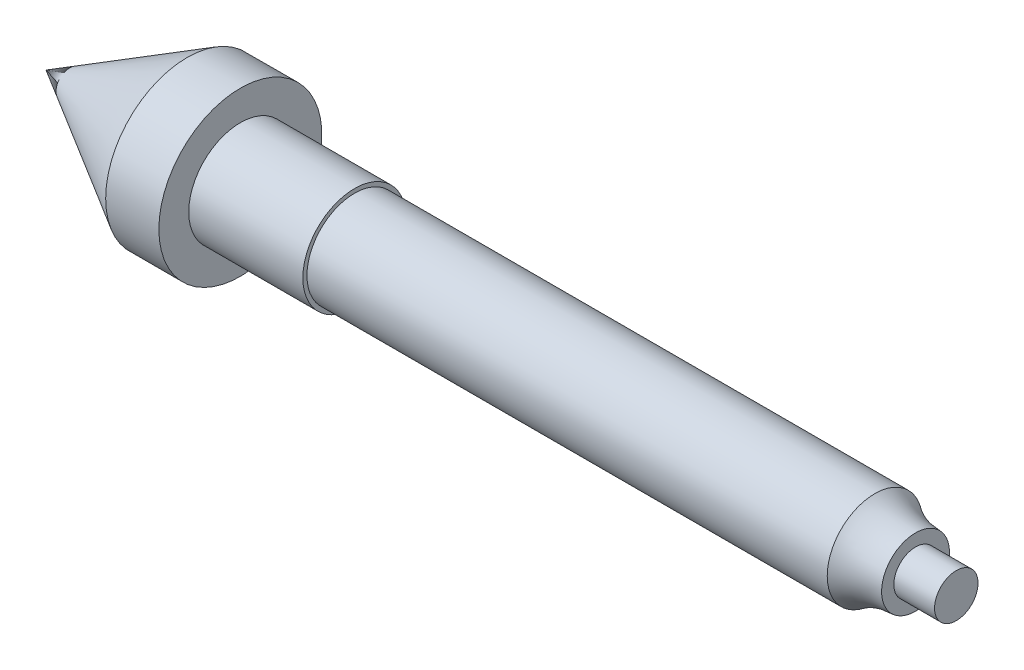
ISO-10303-21;
HEADER;
FILE_DESCRIPTION(('STEP AP214'),'2;1');
FILE_NAME('part.step','',(''),(''),'','','');
FILE_SCHEMA(('AUTOMOTIVE_DESIGN { 1 0 10303 214 1 1 1 1 }'));
ENDSEC;
DATA;
#1=APPLICATION_CONTEXT('core data for automotive mechanical design processes');
#2=APPLICATION_PROTOCOL_DEFINITION('international standard','automotive_design',2000,#1);
#3=PRODUCT_CONTEXT('',#1,'mechanical');
#4=PRODUCT('Part','Part','',(#3));
#5=PRODUCT_RELATED_PRODUCT_CATEGORY('part','',(#4));
#6=PRODUCT_DEFINITION_FORMATION('','',#4);
#7=PRODUCT_DEFINITION_CONTEXT('part definition',#1,'design');
#8=PRODUCT_DEFINITION('design','',#6,#7);
#9=PRODUCT_DEFINITION_SHAPE('','',#8);
#10=(LENGTH_UNIT() NAMED_UNIT(*) SI_UNIT(.MILLI.,.METRE.));
#11=(NAMED_UNIT(*) PLANE_ANGLE_UNIT() SI_UNIT($,.RADIAN.));
#12=(NAMED_UNIT(*) SI_UNIT($,.STERADIAN.) SOLID_ANGLE_UNIT());
#13=UNCERTAINTY_MEASURE_WITH_UNIT(LENGTH_MEASURE(1.E-05),#10,'distance_accuracy_value','');
#14=(GEOMETRIC_REPRESENTATION_CONTEXT(3) GLOBAL_UNCERTAINTY_ASSIGNED_CONTEXT((#13)) GLOBAL_UNIT_ASSIGNED_CONTEXT((#10,
#11,#12)) REPRESENTATION_CONTEXT('',''));
#15=CARTESIAN_POINT('',(0.,0.,0.));
#16=DIRECTION('',(0.,0.,1.));
#17=DIRECTION('',(1.,0.,0.));
#18=AXIS2_PLACEMENT_3D('',#15,#16,#17);
#19=CARTESIAN_POINT('',(-66.5926433104297,0.,0.));
#20=DIRECTION('',(1.,0.,0.));
#21=DIRECTION('',(0.,0.,-1.));
#22=AXIS2_PLACEMENT_3D('',#19,#20,#21);
#23=CONICAL_SURFACE('',#22,0.,0.523598775598301);
#24=CARTESIAN_POINT('',(-14.6311190833636,0.,0.));
#25=DIRECTION('',(-1.,0.,0.));
#26=DIRECTION('',(0.,0.,1.));
#27=AXIS2_PLACEMENT_3D('',#24,#25,#26);
#28=CIRCLE('',#27,30.);
#29=CARTESIAN_POINT('',(-14.6311190833636,0.,30.));
#30=VERTEX_POINT('',#29);
#31=EDGE_CURVE('E54',#30,#30,#28,.T.);
#32=ORIENTED_EDGE('',*,*,#31,.T.);
#33=EDGE_LOOP('',(#32));
#34=FACE_BOUND('',#33,.T.);
#35=CARTESIAN_POINT('',(-66.5926433104297,0.,0.));
#36=VERTEX_POINT('',#35);
#37=VERTEX_LOOP('',#36);
#38=FACE_BOUND('',#37,.T.);
#39=ADVANCED_FACE('F35',(#34,#38),#23,.T.);
#40=CARTESIAN_POINT('',(268.40735668957,0.,0.));
#41=DIRECTION('',(1.,0.,0.));
#42=DIRECTION('',(0.,0.,-1.));
#43=AXIS2_PLACEMENT_3D('',#40,#41,#42);
#44=PLANE('',#43);
#45=CARTESIAN_POINT('',(268.40735668957,0.,0.));
#46=DIRECTION('',(-1.,0.,0.));
#47=DIRECTION('',(0.,0.,1.));
#48=AXIS2_PLACEMENT_3D('',#45,#46,#47);
#49=CIRCLE('',#48,8.);
#50=CARTESIAN_POINT('',(268.40735668957,0.,8.));
#51=VERTEX_POINT('',#50);
#52=EDGE_CURVE('E11',#51,#51,#49,.T.);
#53=ORIENTED_EDGE('',*,*,#52,.F.);
#54=EDGE_LOOP('',(#53));
#55=FACE_BOUND('',#54,.T.);
#56=ADVANCED_FACE('F45',(#55),#44,.T.);
#57=CARTESIAN_POINT('',(-83.378075762655,0.,0.));
#58=DIRECTION('',(-1.,0.,0.));
#59=DIRECTION('',(0.,0.,1.));
#60=AXIS2_PLACEMENT_3D('',#57,#58,#59);
#61=CYLINDRICAL_SURFACE('',#60,8.);
#62=ORIENTED_EDGE('',*,*,#52,.T.);
#63=EDGE_LOOP('',(#62));
#64=FACE_BOUND('',#63,.T.);
#65=CARTESIAN_POINT('',(253.40735668957,0.,0.));
#66=DIRECTION('',(-1.,0.,0.));
#67=DIRECTION('',(0.,0.,1.));
#68=AXIS2_PLACEMENT_3D('',#65,#66,#67);
#69=CIRCLE('',#68,8.);
#70=CARTESIAN_POINT('',(253.40735668957,0.,8.));
#71=VERTEX_POINT('',#70);
#72=EDGE_CURVE('E41',#71,#71,#69,.T.);
#73=ORIENTED_EDGE('',*,*,#72,.F.);
#74=EDGE_LOOP('',(#73));
#75=FACE_BOUND('',#74,.T.);
#76=ADVANCED_FACE('F50',(#64,#75),#61,.T.);
#77=CARTESIAN_POINT('',(253.40735668957,-3.12598535562401E-12,0.));
#78=DIRECTION('',(-1.,0.,0.));
#79=DIRECTION('',(0.,0.,1.));
#80=AXIS2_PLACEMENT_3D('',#77,#78,#79);
#81=PLANE('',#80);
#82=CARTESIAN_POINT('',(253.40735668957,0.,0.));
#83=DIRECTION('',(-1.,0.,0.));
#84=DIRECTION('',(0.,0.,1.));
#85=AXIS2_PLACEMENT_3D('',#82,#83,#84);
#86=CIRCLE('',#85,12.5);
#87=CARTESIAN_POINT('',(253.40735668957,0.,12.5));
#88=VERTEX_POINT('',#87);
#89=EDGE_CURVE('E73',#88,#88,#86,.T.);
#90=ORIENTED_EDGE('',*,*,#89,.F.);
#91=EDGE_LOOP('',(#90));
#92=FACE_BOUND('',#91,.T.);
#93=ORIENTED_EDGE('',*,*,#72,.T.);
#94=EDGE_LOOP('',(#93));
#95=FACE_BOUND('',#94,.T.);
#96=ADVANCED_FACE('F78',(#92,#95),#81,.F.);
#97=CARTESIAN_POINT('',(253.407356689571,0.,0.));
#98=DIRECTION('',(-1.,0.,0.));
#99=DIRECTION('',(0.,0.,1.));
#100=AXIS2_PLACEMENT_3D('',#97,#98,#99);
#101=TOROIDAL_SURFACE('',#100,37.5000000000012,25.0000000000012);
#102=CARTESIAN_POINT('',(238.40735668957,0.,0.));
#103=DIRECTION('',(-1.,0.,0.));
#104=DIRECTION('',(0.,0.,1.));
#105=AXIS2_PLACEMENT_3D('',#102,#103,#104);
#106=CIRCLE('',#105,17.5);
#107=CARTESIAN_POINT('',(238.40735668957,0.,17.5));
#108=VERTEX_POINT('',#107);
#109=EDGE_CURVE('E70',#108,#108,#106,.T.);
#110=ORIENTED_EDGE('',*,*,#109,.F.);
#111=EDGE_LOOP('',(#110));
#112=FACE_BOUND('',#111,.T.);
#113=ORIENTED_EDGE('',*,*,#89,.T.);
#114=EDGE_LOOP('',(#113));
#115=FACE_BOUND('',#114,.T.);
#116=ADVANCED_FACE('F86',(#112,#115),#101,.F.);
#117=CARTESIAN_POINT('',(-83.378075762655,0.,0.));
#118=DIRECTION('',(-1.,0.,0.));
#119=DIRECTION('',(0.,0.,1.));
#120=AXIS2_PLACEMENT_3D('',#117,#118,#119);
#121=CYLINDRICAL_SURFACE('',#120,17.5);
#122=ORIENTED_EDGE('',*,*,#109,.T.);
#123=EDGE_LOOP('',(#122));
#124=FACE_BOUND('',#123,.T.);
#125=CARTESIAN_POINT('',(46.9371764977347,0.,0.));
#126=DIRECTION('',(-1.,0.,0.));
#127=DIRECTION('',(0.,0.,1.));
#128=AXIS2_PLACEMENT_3D('',#125,#126,#127);
#129=CIRCLE('',#128,17.5);
#130=CARTESIAN_POINT('',(46.9371764977347,0.,17.5));
#131=VERTEX_POINT('',#130);
#132=EDGE_CURVE('E67',#131,#131,#129,.T.);
#133=ORIENTED_EDGE('',*,*,#132,.F.);
#134=EDGE_LOOP('',(#133));
#135=FACE_BOUND('',#134,.T.);
#136=ADVANCED_FACE('F92',(#124,#135),#121,.T.);
#137=CARTESIAN_POINT('',(46.9371764977347,0.,0.));
#138=DIRECTION('',(1.,0.,0.));
#139=DIRECTION('',(0.,0.,-1.));
#140=AXIS2_PLACEMENT_3D('',#137,#138,#139);
#141=PLANE('',#140);
#142=ORIENTED_EDGE('',*,*,#132,.T.);
#143=EDGE_LOOP('',(#142));
#144=FACE_BOUND('',#143,.T.);
#145=CARTESIAN_POINT('',(46.9371764977347,0.,0.));
#146=DIRECTION('',(-1.,0.,0.));
#147=DIRECTION('',(0.,0.,1.));
#148=AXIS2_PLACEMENT_3D('',#145,#146,#147);
#149=CIRCLE('',#148,19.);
#150=CARTESIAN_POINT('',(46.9371764977347,0.,19.));
#151=VERTEX_POINT('',#150);
#152=EDGE_CURVE('E64',#151,#151,#149,.T.);
#153=ORIENTED_EDGE('',*,*,#152,.F.);
#154=EDGE_LOOP('',(#153));
#155=FACE_BOUND('',#154,.T.);
#156=ADVANCED_FACE('F96',(#144,#155),#141,.T.);
#157=CARTESIAN_POINT('',(-83.378075762655,0.,0.));
#158=DIRECTION('',(-1.,0.,0.));
#159=DIRECTION('',(0.,0.,1.));
#160=AXIS2_PLACEMENT_3D('',#157,#158,#159);
#161=CYLINDRICAL_SURFACE('',#160,19.);
#162=ORIENTED_EDGE('',*,*,#152,.T.);
#163=EDGE_LOOP('',(#162));
#164=FACE_BOUND('',#163,.T.);
#165=CARTESIAN_POINT('',(4.93717649773469,0.,0.));
#166=DIRECTION('',(-1.,0.,0.));
#167=DIRECTION('',(0.,0.,1.));
#168=AXIS2_PLACEMENT_3D('',#165,#166,#167);
#169=CIRCLE('',#168,19.);
#170=CARTESIAN_POINT('',(4.93717649773469,0.,19.));
#171=VERTEX_POINT('',#170);
#172=EDGE_CURVE('E59',#171,#171,#169,.T.);
#173=ORIENTED_EDGE('',*,*,#172,.F.);
#174=EDGE_LOOP('',(#173));
#175=FACE_BOUND('',#174,.T.);
#176=ADVANCED_FACE('F100',(#164,#175),#161,.T.);
#177=CARTESIAN_POINT('',(4.93717649773469,0.,0.));
#178=DIRECTION('',(1.,0.,0.));
#179=DIRECTION('',(0.,0.,-1.));
#180=AXIS2_PLACEMENT_3D('',#177,#178,#179);
#181=PLANE('',#180);
#182=ORIENTED_EDGE('',*,*,#172,.T.);
#183=EDGE_LOOP('',(#182));
#184=FACE_BOUND('',#183,.T.);
#185=CARTESIAN_POINT('',(4.93717649773469,0.,0.));
#186=DIRECTION('',(-1.,0.,0.));
#187=DIRECTION('',(0.,0.,1.));
#188=AXIS2_PLACEMENT_3D('',#185,#186,#187);
#189=CIRCLE('',#188,30.);
#190=CARTESIAN_POINT('',(4.93717649773469,0.,30.));
#191=VERTEX_POINT('',#190);
#192=EDGE_CURVE('E56',#191,#191,#189,.T.);
#193=ORIENTED_EDGE('',*,*,#192,.F.);
#194=EDGE_LOOP('',(#193));
#195=FACE_BOUND('',#194,.T.);
#196=ADVANCED_FACE('F104',(#184,#195),#181,.T.);
#197=CARTESIAN_POINT('',(-83.378075762655,0.,0.));
#198=DIRECTION('',(-1.,0.,0.));
#199=DIRECTION('',(0.,0.,1.));
#200=AXIS2_PLACEMENT_3D('',#197,#198,#199);
#201=CYLINDRICAL_SURFACE('',#200,30.);
#202=ORIENTED_EDGE('',*,*,#192,.T.);
#203=EDGE_LOOP('',(#202));
#204=FACE_BOUND('',#203,.T.);
#205=ORIENTED_EDGE('',*,*,#31,.F.);
#206=EDGE_LOOP('',(#205));
#207=FACE_BOUND('',#206,.T.);
#208=ADVANCED_FACE('F108',(#204,#207),#201,.T.);
#209=CLOSED_SHELL('',(#39,#56,#76,#96,#116,#136,#156,#176,#196,#208));
#210=MANIFOLD_SOLID_BREP('B2',#209);
#211=ADVANCED_BREP_SHAPE_REPRESENTATION('',(#18,#210),#14);
#212=SHAPE_DEFINITION_REPRESENTATION(#9,#211);
ENDSEC;
END-ISO-10303-21;
